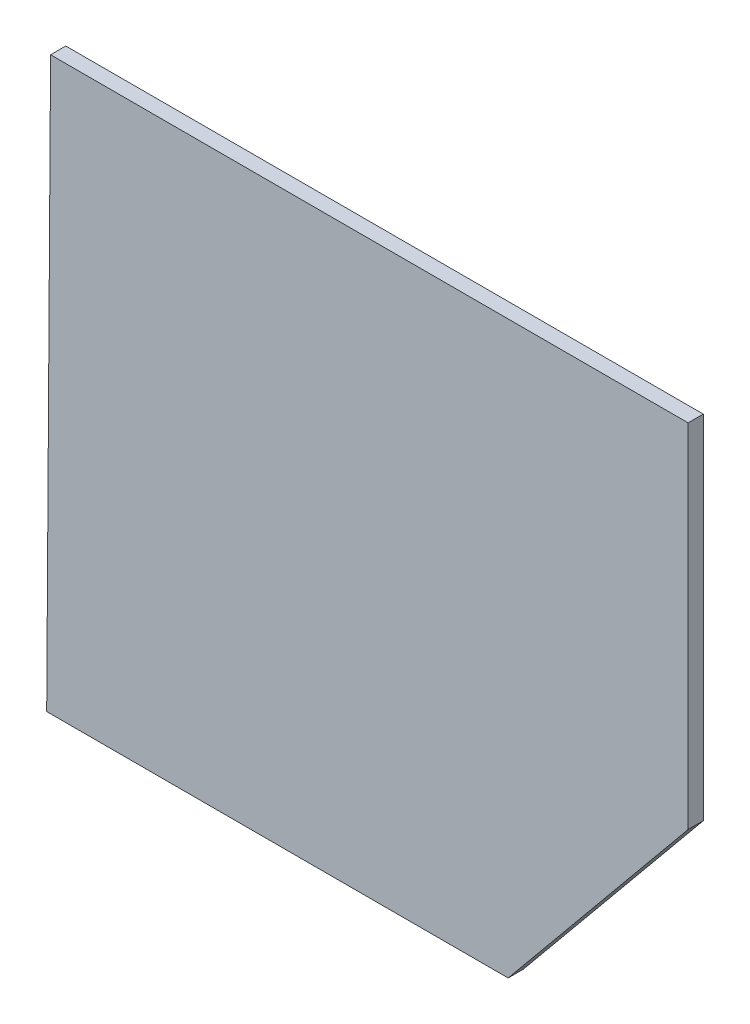
ISO-10303-21;
HEADER;
FILE_DESCRIPTION(('STEP AP214'),'2;1');
FILE_NAME('part.step','',(''),(''),'','','');
FILE_SCHEMA(('AUTOMOTIVE_DESIGN { 1 0 10303 214 1 1 1 1 }'));
ENDSEC;
DATA;
#1=APPLICATION_CONTEXT('core data for automotive mechanical design processes');
#2=APPLICATION_PROTOCOL_DEFINITION('international standard','automotive_design',2000,#1);
#3=PRODUCT_CONTEXT('',#1,'mechanical');
#4=PRODUCT('Part','Part','',(#3));
#5=PRODUCT_RELATED_PRODUCT_CATEGORY('part','',(#4));
#6=PRODUCT_DEFINITION_FORMATION('','',#4);
#7=PRODUCT_DEFINITION_CONTEXT('part definition',#1,'design');
#8=PRODUCT_DEFINITION('design','',#6,#7);
#9=PRODUCT_DEFINITION_SHAPE('','',#8);
#10=(LENGTH_UNIT() NAMED_UNIT(*) SI_UNIT(.MILLI.,.METRE.));
#11=(NAMED_UNIT(*) PLANE_ANGLE_UNIT() SI_UNIT($,.RADIAN.));
#12=(NAMED_UNIT(*) SI_UNIT($,.STERADIAN.) SOLID_ANGLE_UNIT());
#13=UNCERTAINTY_MEASURE_WITH_UNIT(LENGTH_MEASURE(1.E-05),#10,'distance_accuracy_value','');
#14=(GEOMETRIC_REPRESENTATION_CONTEXT(3) GLOBAL_UNCERTAINTY_ASSIGNED_CONTEXT((#13)) GLOBAL_UNIT_ASSIGNED_CONTEXT((#10,
#11,#12)) REPRESENTATION_CONTEXT('',''));
#15=CARTESIAN_POINT('',(0.,0.,0.));
#16=DIRECTION('',(0.,0.,1.));
#17=DIRECTION('',(1.,0.,0.));
#18=AXIS2_PLACEMENT_3D('',#15,#16,#17);
#19=CARTESIAN_POINT('',(-2090.0928,-105.089720641288,3.175));
#20=DIRECTION('',(0.,1.,0.));
#21=DIRECTION('',(-1.,0.,0.));
#22=AXIS2_PLACEMENT_3D('',#19,#20,#21);
#23=PLANE('',#22);
#24=DIRECTION('',(1.,0.,0.));
#25=VECTOR('',#24,1.);
#26=CARTESIAN_POINT('',(-2090.0928,-105.089720641288,0.));
#27=LINE('',#26,#25);
#28=CARTESIAN_POINT('',(-2090.0928,-105.089720641288,0.));
#29=VERTEX_POINT('',#28);
#30=CARTESIAN_POINT('',(-1993.5728,-105.089720641288,0.));
#31=VERTEX_POINT('',#30);
#32=EDGE_CURVE('E107',#29,#31,#27,.T.);
#33=ORIENTED_EDGE('',*,*,#32,.T.);
#34=DIRECTION('',(0.,0.,-1.));
#35=VECTOR('',#34,1.);
#36=CARTESIAN_POINT('',(-1993.5728,-105.089720641288,3.175));
#37=LINE('',#36,#35);
#38=CARTESIAN_POINT('',(-1993.5728,-105.089720641288,3.175));
#39=VERTEX_POINT('',#38);
#40=EDGE_CURVE('E11',#39,#31,#37,.T.);
#41=ORIENTED_EDGE('',*,*,#40,.F.);
#42=DIRECTION('',(1.,0.,0.));
#43=VECTOR('',#42,1.);
#44=CARTESIAN_POINT('',(-2090.0928,-105.089720641288,3.175));
#45=LINE('',#44,#43);
#46=CARTESIAN_POINT('',(-2090.0928,-105.089720641288,3.175));
#47=VERTEX_POINT('',#46);
#48=EDGE_CURVE('E115',#47,#39,#45,.T.);
#49=ORIENTED_EDGE('',*,*,#48,.F.);
#50=DIRECTION('',(0.,0.,-1.));
#51=VECTOR('',#50,1.);
#52=CARTESIAN_POINT('',(-2090.0928,-105.089720641288,3.175));
#53=LINE('',#52,#51);
#54=EDGE_CURVE('E103',#47,#29,#53,.T.);
#55=ORIENTED_EDGE('',*,*,#54,.T.);
#56=EDGE_LOOP('',(#33,#41,#49,#55));
#57=FACE_BOUND('',#56,.T.);
#58=ADVANCED_FACE('F33',(#57),#23,.F.);
#59=CARTESIAN_POINT('',(-1993.5728,-105.089720641288,3.175));
#60=DIRECTION('',(-0.771987614751848,0.63563757178895,0.));
#61=DIRECTION('',(-0.63563757178895,-0.771987614751848,0.));
#62=AXIS2_PLACEMENT_3D('',#59,#60,#61);
#63=PLANE('',#62);
#64=DIRECTION('',(0.63563757178895,0.771987614751848,0.));
#65=VECTOR('',#64,1.);
#66=CARTESIAN_POINT('',(-1993.5728,-105.089720641288,0.));
#67=LINE('',#66,#65);
#68=CARTESIAN_POINT('',(-1955.92796059214,-59.3697206412883,0.));
#69=VERTEX_POINT('',#68);
#70=EDGE_CURVE('E110',#31,#69,#67,.T.);
#71=ORIENTED_EDGE('',*,*,#70,.T.);
#72=DIRECTION('',(0.,0.,-1.));
#73=VECTOR('',#72,1.);
#74=CARTESIAN_POINT('',(-1955.92796059214,-59.3697206412883,3.175));
#75=LINE('',#74,#73);
#76=CARTESIAN_POINT('',(-1955.92796059214,-59.3697206412883,3.175));
#77=VERTEX_POINT('',#76);
#78=EDGE_CURVE('E41',#77,#69,#75,.T.);
#79=ORIENTED_EDGE('',*,*,#78,.F.);
#80=DIRECTION('',(0.63563757178895,0.771987614751848,0.));
#81=VECTOR('',#80,1.);
#82=CARTESIAN_POINT('',(-1993.5728,-105.089720641288,3.175));
#83=LINE('',#82,#81);
#84=EDGE_CURVE('E83',#39,#77,#83,.T.);
#85=ORIENTED_EDGE('',*,*,#84,.F.);
#86=ORIENTED_EDGE('',*,*,#40,.T.);
#87=EDGE_LOOP('',(#71,#79,#85,#86));
#88=FACE_BOUND('',#87,.T.);
#89=ADVANCED_FACE('F134',(#88),#63,.F.);
#90=CARTESIAN_POINT('',(-1955.92796059214,-59.3697206412883,3.175));
#91=DIRECTION('',(-1.,0.,0.));
#92=DIRECTION('',(0.,0.,1.));
#93=AXIS2_PLACEMENT_3D('',#90,#91,#92);
#94=PLANE('',#93);
#95=DIRECTION('',(0.,1.,0.));
#96=VECTOR('',#95,1.);
#97=CARTESIAN_POINT('',(-1955.92796059214,-59.3697206412883,0.));
#98=LINE('',#97,#96);
#99=CARTESIAN_POINT('',(-1955.92796059214,14.2902793587117,0.));
#100=VERTEX_POINT('',#99);
#101=EDGE_CURVE('E98',#69,#100,#98,.T.);
#102=ORIENTED_EDGE('',*,*,#101,.T.);
#103=DIRECTION('',(0.,0.,-1.));
#104=VECTOR('',#103,1.);
#105=CARTESIAN_POINT('',(-1955.92796059214,14.2902793587117,3.175));
#106=LINE('',#105,#104);
#107=CARTESIAN_POINT('',(-1955.92796059214,14.2902793587117,3.175));
#108=VERTEX_POINT('',#107);
#109=EDGE_CURVE('E95',#108,#100,#106,.T.);
#110=ORIENTED_EDGE('',*,*,#109,.F.);
#111=DIRECTION('',(0.,1.,0.));
#112=VECTOR('',#111,1.);
#113=CARTESIAN_POINT('',(-1955.92796059214,-59.3697206412883,3.175));
#114=LINE('',#113,#112);
#115=EDGE_CURVE('E87',#77,#108,#114,.T.);
#116=ORIENTED_EDGE('',*,*,#115,.F.);
#117=ORIENTED_EDGE('',*,*,#78,.T.);
#118=EDGE_LOOP('',(#102,#110,#116,#117));
#119=FACE_BOUND('',#118,.T.);
#120=ADVANCED_FACE('F96',(#119),#94,.F.);
#121=CARTESIAN_POINT('',(-1955.92796059214,14.2902793587117,3.175));
#122=DIRECTION('',(0.,-1.,0.));
#123=DIRECTION('',(1.,0.,0.));
#124=AXIS2_PLACEMENT_3D('',#121,#122,#123);
#125=PLANE('',#124);
#126=DIRECTION('',(-1.,0.,0.));
#127=VECTOR('',#126,1.);
#128=CARTESIAN_POINT('',(-1955.92796059214,14.2902793587117,0.));
#129=LINE('',#128,#127);
#130=CARTESIAN_POINT('',(-2089.27796059214,14.2902793587117,0.));
#131=VERTEX_POINT('',#130);
#132=EDGE_CURVE('E69',#100,#131,#129,.T.);
#133=ORIENTED_EDGE('',*,*,#132,.T.);
#134=DIRECTION('',(0.,0.,-1.));
#135=VECTOR('',#134,1.);
#136=CARTESIAN_POINT('',(-2089.27796059214,14.2902793587117,3.175));
#137=LINE('',#136,#135);
#138=CARTESIAN_POINT('',(-2089.27796059214,14.2902793587117,3.175));
#139=VERTEX_POINT('',#138);
#140=EDGE_CURVE('E99',#139,#131,#137,.T.);
#141=ORIENTED_EDGE('',*,*,#140,.F.);
#142=DIRECTION('',(-1.,0.,0.));
#143=VECTOR('',#142,1.);
#144=CARTESIAN_POINT('',(-1955.92796059214,14.2902793587117,3.175));
#145=LINE('',#144,#143);
#146=EDGE_CURVE('E91',#108,#139,#145,.T.);
#147=ORIENTED_EDGE('',*,*,#146,.F.);
#148=ORIENTED_EDGE('',*,*,#109,.T.);
#149=EDGE_LOOP('',(#133,#141,#147,#148));
#150=FACE_BOUND('',#149,.T.);
#151=ADVANCED_FACE('F101',(#150),#125,.F.);
#152=CARTESIAN_POINT('',(-2089.27796059214,14.2902793587117,3.175));
#153=DIRECTION('',(0.999976706447404,-0.0068254349753396,0.));
#154=DIRECTION('',(0.0068254349753396,0.999976706447404,0.));
#155=AXIS2_PLACEMENT_3D('',#152,#153,#154);
#156=PLANE('',#155);
#157=DIRECTION('',(-0.0068254349753396,-0.999976706447404,0.));
#158=VECTOR('',#157,1.);
#159=CARTESIAN_POINT('',(-2089.27796059214,14.2902793587117,0.));
#160=LINE('',#159,#158);
#161=EDGE_CURVE('E75',#131,#29,#160,.T.);
#162=ORIENTED_EDGE('',*,*,#161,.T.);
#163=ORIENTED_EDGE('',*,*,#54,.F.);
#164=DIRECTION('',(-0.0068254349753396,-0.999976706447404,0.));
#165=VECTOR('',#164,1.);
#166=CARTESIAN_POINT('',(-2089.27796059214,14.2902793587117,3.175));
#167=LINE('',#166,#165);
#168=EDGE_CURVE('E49',#139,#47,#167,.T.);
#169=ORIENTED_EDGE('',*,*,#168,.F.);
#170=ORIENTED_EDGE('',*,*,#140,.T.);
#171=EDGE_LOOP('',(#162,#163,#169,#170));
#172=FACE_BOUND('',#171,.T.);
#173=ADVANCED_FACE('F123',(#172),#156,.F.);
#174=CARTESIAN_POINT('',(0.,0.,3.175));
#175=DIRECTION('',(0.,0.,1.));
#176=DIRECTION('',(1.,0.,0.));
#177=AXIS2_PLACEMENT_3D('',#174,#175,#176);
#178=PLANE('',#177);
#179=ORIENTED_EDGE('',*,*,#48,.T.);
#180=ORIENTED_EDGE('',*,*,#84,.T.);
#181=ORIENTED_EDGE('',*,*,#115,.T.);
#182=ORIENTED_EDGE('',*,*,#146,.T.);
#183=ORIENTED_EDGE('',*,*,#168,.T.);
#184=EDGE_LOOP('',(#179,#180,#181,#182,#183));
#185=FACE_BOUND('',#184,.T.);
#186=ADVANCED_FACE('F89',(#185),#178,.T.);
#187=CARTESIAN_POINT('',(0.,0.,0.));
#188=DIRECTION('',(0.,0.,1.));
#189=DIRECTION('',(1.,0.,0.));
#190=AXIS2_PLACEMENT_3D('',#187,#188,#189);
#191=PLANE('',#190);
#192=ORIENTED_EDGE('',*,*,#32,.F.);
#193=ORIENTED_EDGE('',*,*,#161,.F.);
#194=ORIENTED_EDGE('',*,*,#132,.F.);
#195=ORIENTED_EDGE('',*,*,#101,.F.);
#196=ORIENTED_EDGE('',*,*,#70,.F.);
#197=EDGE_LOOP('',(#192,#193,#194,#195,#196));
#198=FACE_BOUND('',#197,.T.);
#199=ADVANCED_FACE('F119',(#198),#191,.F.);
#200=CLOSED_SHELL('',(#58,#89,#120,#151,#173,#186,#199));
#201=MANIFOLD_SOLID_BREP('B2',#200);
#202=ADVANCED_BREP_SHAPE_REPRESENTATION('',(#18,#201),#14);
#203=SHAPE_DEFINITION_REPRESENTATION(#9,#202);
ENDSEC;
END-ISO-10303-21;
